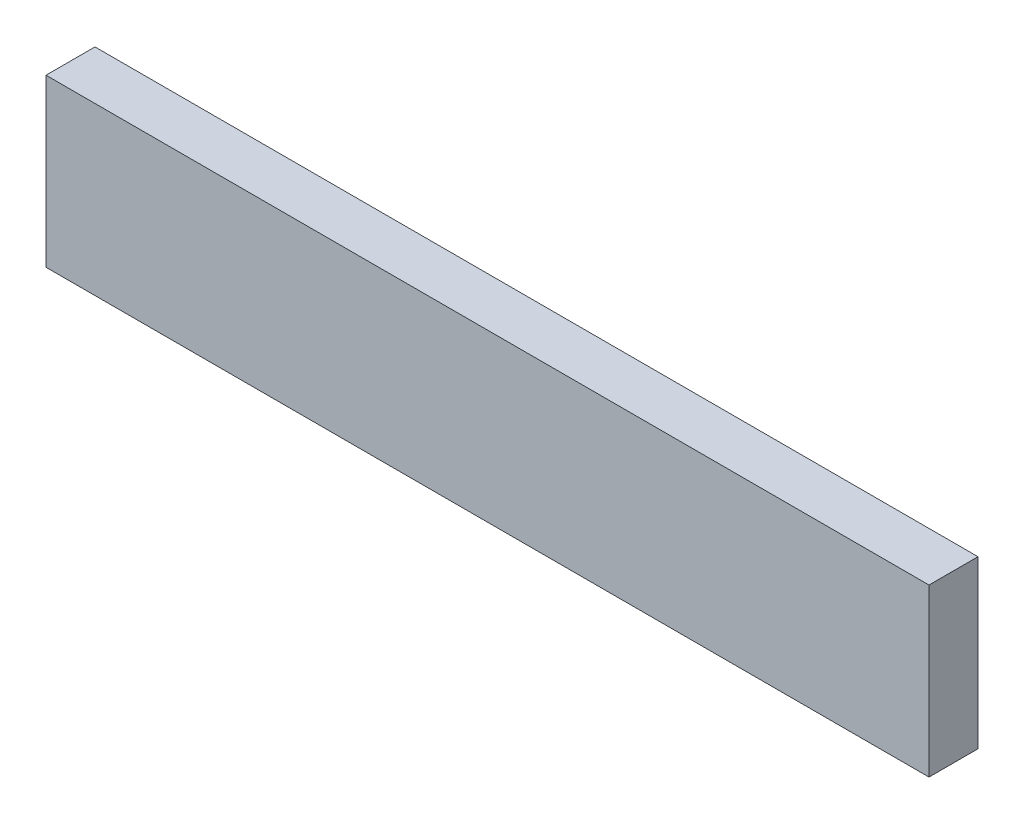
ISO-10303-21;
HEADER;
FILE_DESCRIPTION(('STEP AP214'),'2;1');
FILE_NAME('part.step','',(''),(''),'','','');
FILE_SCHEMA(('AUTOMOTIVE_DESIGN { 1 0 10303 214 1 1 1 1 }'));
ENDSEC;
DATA;
#1=APPLICATION_CONTEXT('core data for automotive mechanical design processes');
#2=APPLICATION_PROTOCOL_DEFINITION('international standard','automotive_design',2000,#1);
#3=PRODUCT_CONTEXT('',#1,'mechanical');
#4=PRODUCT('Part','Part','',(#3));
#5=PRODUCT_RELATED_PRODUCT_CATEGORY('part','',(#4));
#6=PRODUCT_DEFINITION_FORMATION('','',#4);
#7=PRODUCT_DEFINITION_CONTEXT('part definition',#1,'design');
#8=PRODUCT_DEFINITION('design','',#6,#7);
#9=PRODUCT_DEFINITION_SHAPE('','',#8);
#10=(LENGTH_UNIT() NAMED_UNIT(*) SI_UNIT(.MILLI.,.METRE.));
#11=(NAMED_UNIT(*) PLANE_ANGLE_UNIT() SI_UNIT($,.RADIAN.));
#12=(NAMED_UNIT(*) SI_UNIT($,.STERADIAN.) SOLID_ANGLE_UNIT());
#13=UNCERTAINTY_MEASURE_WITH_UNIT(LENGTH_MEASURE(1.E-05),#10,'distance_accuracy_value','');
#14=(GEOMETRIC_REPRESENTATION_CONTEXT(3) GLOBAL_UNCERTAINTY_ASSIGNED_CONTEXT((#13)) GLOBAL_UNIT_ASSIGNED_CONTEXT((#10,
#11,#12)) REPRESENTATION_CONTEXT('',''));
#15=CARTESIAN_POINT('',(0.,0.,0.));
#16=DIRECTION('',(0.,0.,1.));
#17=DIRECTION('',(1.,0.,0.));
#18=AXIS2_PLACEMENT_3D('',#15,#16,#17);
#19=CARTESIAN_POINT('',(0.,0.,0.));
#20=DIRECTION('',(0.,0.,1.));
#21=DIRECTION('',(1.,0.,0.));
#22=AXIS2_PLACEMENT_3D('',#19,#20,#21);
#23=PLANE('',#22);
#24=DIRECTION('',(0.,1.,0.));
#25=VECTOR('',#24,1.);
#26=CARTESIAN_POINT('',(-7.0104,1.3208,0.));
#27=LINE('',#26,#25);
#28=CARTESIAN_POINT('',(-7.0104,1.3208,0.));
#29=VERTEX_POINT('',#28);
#30=CARTESIAN_POINT('',(-7.0104,-1.3208,0.));
#31=VERTEX_POINT('',#30);
#32=EDGE_CURVE('E78',#29,#31,#27,.F.);
#33=ORIENTED_EDGE('',*,*,#32,.F.);
#34=DIRECTION('',(1.,0.,0.));
#35=VECTOR('',#34,1.);
#36=CARTESIAN_POINT('',(7.0104,1.3208,0.));
#37=LINE('',#36,#35);
#38=CARTESIAN_POINT('',(7.0104,1.3208,0.));
#39=VERTEX_POINT('',#38);
#40=EDGE_CURVE('E54',#39,#29,#37,.F.);
#41=ORIENTED_EDGE('',*,*,#40,.F.);
#42=DIRECTION('',(0.,1.,0.));
#43=VECTOR('',#42,1.);
#44=CARTESIAN_POINT('',(7.0104,-1.3208,0.));
#45=LINE('',#44,#43);
#46=CARTESIAN_POINT('',(7.0104,-1.3208,0.));
#47=VERTEX_POINT('',#46);
#48=EDGE_CURVE('E56',#47,#39,#45,.T.);
#49=ORIENTED_EDGE('',*,*,#48,.F.);
#50=DIRECTION('',(1.,0.,0.));
#51=VECTOR('',#50,1.);
#52=CARTESIAN_POINT('',(-7.0104,-1.3208,0.));
#53=LINE('',#52,#51);
#54=EDGE_CURVE('E19',#31,#47,#53,.T.);
#55=ORIENTED_EDGE('',*,*,#54,.F.);
#56=EDGE_LOOP('',(#33,#41,#49,#55));
#57=FACE_BOUND('',#56,.T.);
#58=ADVANCED_FACE('F16',(#57),#23,.F.);
#59=CARTESIAN_POINT('',(-7.0104,-1.3208,0.));
#60=DIRECTION('',(0.,-1.,0.));
#61=DIRECTION('',(0.,0.,-1.));
#62=AXIS2_PLACEMENT_3D('',#59,#60,#61);
#63=PLANE('',#62);
#64=DIRECTION('',(1.,0.,0.));
#65=VECTOR('',#64,1.);
#66=CARTESIAN_POINT('',(0.,-1.3208,0.778000000000002));
#67=LINE('',#66,#65);
#68=CARTESIAN_POINT('',(-7.0104,-1.3208,0.778000000000001));
#69=VERTEX_POINT('',#68);
#70=CARTESIAN_POINT('',(7.0104,-1.3208,0.778000000000002));
#71=VERTEX_POINT('',#70);
#72=EDGE_CURVE('E82',#69,#71,#67,.T.);
#73=ORIENTED_EDGE('',*,*,#72,.F.);
#74=DIRECTION('',(0.,0.,1.));
#75=VECTOR('',#74,1.);
#76=CARTESIAN_POINT('',(-7.0104,-1.3208,0.));
#77=LINE('',#76,#75);
#78=EDGE_CURVE('E67',#31,#69,#77,.T.);
#79=ORIENTED_EDGE('',*,*,#78,.F.);
#80=ORIENTED_EDGE('',*,*,#54,.T.);
#81=DIRECTION('',(0.,0.,-1.));
#82=VECTOR('',#81,1.);
#83=CARTESIAN_POINT('',(7.0104,-1.3208,0.));
#84=LINE('',#83,#82);
#85=EDGE_CURVE('E62',#71,#47,#84,.T.);
#86=ORIENTED_EDGE('',*,*,#85,.F.);
#87=EDGE_LOOP('',(#73,#79,#80,#86));
#88=FACE_BOUND('',#87,.T.);
#89=ADVANCED_FACE('F64',(#88),#63,.T.);
#90=CARTESIAN_POINT('',(7.0104,-1.3208,0.));
#91=DIRECTION('',(1.,0.,0.));
#92=DIRECTION('',(0.,0.,-1.));
#93=AXIS2_PLACEMENT_3D('',#90,#91,#92);
#94=PLANE('',#93);
#95=DIRECTION('',(0.,-1.,0.));
#96=VECTOR('',#95,1.);
#97=CARTESIAN_POINT('',(7.0104,0.,0.778000000000002));
#98=LINE('',#97,#96);
#99=CARTESIAN_POINT('',(7.0104,1.3208,0.778));
#100=VERTEX_POINT('',#99);
#101=EDGE_CURVE('E71',#71,#100,#98,.F.);
#102=ORIENTED_EDGE('',*,*,#101,.F.);
#103=ORIENTED_EDGE('',*,*,#85,.T.);
#104=ORIENTED_EDGE('',*,*,#48,.T.);
#105=DIRECTION('',(0.,0.,1.));
#106=VECTOR('',#105,1.);
#107=CARTESIAN_POINT('',(7.0104,1.3208,0.));
#108=LINE('',#107,#106);
#109=EDGE_CURVE('E74',#100,#39,#108,.F.);
#110=ORIENTED_EDGE('',*,*,#109,.F.);
#111=EDGE_LOOP('',(#102,#103,#104,#110));
#112=FACE_BOUND('',#111,.T.);
#113=ADVANCED_FACE('F69',(#112),#94,.T.);
#114=CARTESIAN_POINT('',(7.0104,1.3208,0.));
#115=DIRECTION('',(0.,1.,0.));
#116=DIRECTION('',(0.,0.,1.));
#117=AXIS2_PLACEMENT_3D('',#114,#115,#116);
#118=PLANE('',#117);
#119=DIRECTION('',(1.,0.,0.));
#120=VECTOR('',#119,1.);
#121=CARTESIAN_POINT('',(0.,1.3208,0.778000000000002));
#122=LINE('',#121,#120);
#123=CARTESIAN_POINT('',(-7.0104,1.3208,0.777999999999999));
#124=VERTEX_POINT('',#123);
#125=EDGE_CURVE('E25',#100,#124,#122,.F.);
#126=ORIENTED_EDGE('',*,*,#125,.F.);
#127=ORIENTED_EDGE('',*,*,#109,.T.);
#128=ORIENTED_EDGE('',*,*,#40,.T.);
#129=DIRECTION('',(0.,0.,1.));
#130=VECTOR('',#129,1.);
#131=CARTESIAN_POINT('',(-7.0104,1.3208,0.));
#132=LINE('',#131,#130);
#133=EDGE_CURVE('E34',#124,#29,#132,.F.);
#134=ORIENTED_EDGE('',*,*,#133,.F.);
#135=EDGE_LOOP('',(#126,#127,#128,#134));
#136=FACE_BOUND('',#135,.T.);
#137=ADVANCED_FACE('F88',(#136),#118,.T.);
#138=CARTESIAN_POINT('',(-7.0104,1.3208,0.));
#139=DIRECTION('',(-1.,0.,0.));
#140=DIRECTION('',(0.,0.,1.));
#141=AXIS2_PLACEMENT_3D('',#138,#139,#140);
#142=PLANE('',#141);
#143=DIRECTION('',(0.,-1.,0.));
#144=VECTOR('',#143,1.);
#145=CARTESIAN_POINT('',(-7.0104,0.,0.778000000000002));
#146=LINE('',#145,#144);
#147=EDGE_CURVE('E11',#124,#69,#146,.T.);
#148=ORIENTED_EDGE('',*,*,#147,.F.);
#149=ORIENTED_EDGE('',*,*,#133,.T.);
#150=ORIENTED_EDGE('',*,*,#32,.T.);
#151=ORIENTED_EDGE('',*,*,#78,.T.);
#152=EDGE_LOOP('',(#148,#149,#150,#151));
#153=FACE_BOUND('',#152,.T.);
#154=ADVANCED_FACE('F90',(#153),#142,.T.);
#155=CARTESIAN_POINT('',(0.,0.,0.778000000000002));
#156=DIRECTION('',(0.,0.,1.));
#157=DIRECTION('',(0.,-1.,0.));
#158=AXIS2_PLACEMENT_3D('',#155,#156,#157);
#159=PLANE('',#158);
#160=ORIENTED_EDGE('',*,*,#125,.T.);
#161=ORIENTED_EDGE('',*,*,#147,.T.);
#162=ORIENTED_EDGE('',*,*,#72,.T.);
#163=ORIENTED_EDGE('',*,*,#101,.T.);
#164=EDGE_LOOP('',(#160,#161,#162,#163));
#165=FACE_BOUND('',#164,.T.);
#166=ADVANCED_FACE('F87',(#165),#159,.T.);
#167=CLOSED_SHELL('',(#58,#89,#113,#137,#154,#166));
#168=MANIFOLD_SOLID_BREP('B1',#167);
#169=ADVANCED_BREP_SHAPE_REPRESENTATION('',(#18,#168),#14);
#170=SHAPE_DEFINITION_REPRESENTATION(#9,#169);
ENDSEC;
END-ISO-10303-21;
